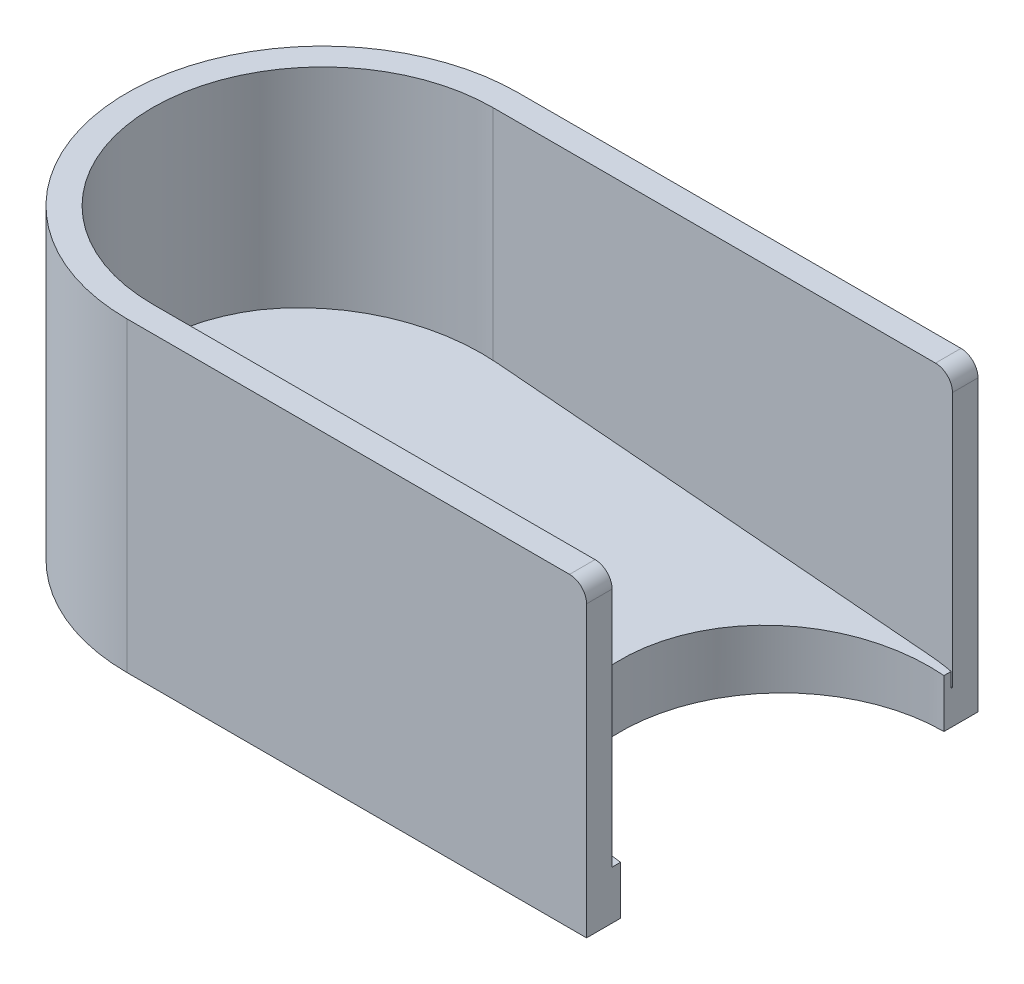
ISO-10303-21;
HEADER;
FILE_DESCRIPTION(('STEP AP214'),'2;1');
FILE_NAME('part.step','',(''),(''),'','','');
FILE_SCHEMA(('AUTOMOTIVE_DESIGN { 1 0 10303 214 1 1 1 1 }'));
ENDSEC;
DATA;
#1=APPLICATION_CONTEXT('core data for automotive mechanical design processes');
#2=APPLICATION_PROTOCOL_DEFINITION('international standard','automotive_design',2000,#1);
#3=PRODUCT_CONTEXT('',#1,'mechanical');
#4=PRODUCT('Part','Part','',(#3));
#5=PRODUCT_RELATED_PRODUCT_CATEGORY('part','',(#4));
#6=PRODUCT_DEFINITION_FORMATION('','',#4);
#7=PRODUCT_DEFINITION_CONTEXT('part definition',#1,'design');
#8=PRODUCT_DEFINITION('design','',#6,#7);
#9=PRODUCT_DEFINITION_SHAPE('','',#8);
#10=(LENGTH_UNIT() NAMED_UNIT(*) SI_UNIT(.MILLI.,.METRE.));
#11=(NAMED_UNIT(*) PLANE_ANGLE_UNIT() SI_UNIT($,.RADIAN.));
#12=(NAMED_UNIT(*) SI_UNIT($,.STERADIAN.) SOLID_ANGLE_UNIT());
#13=UNCERTAINTY_MEASURE_WITH_UNIT(LENGTH_MEASURE(1.E-05),#10,'distance_accuracy_value','');
#14=(GEOMETRIC_REPRESENTATION_CONTEXT(3) GLOBAL_UNCERTAINTY_ASSIGNED_CONTEXT((#13)) GLOBAL_UNIT_ASSIGNED_CONTEXT((#10,
#11,#12)) REPRESENTATION_CONTEXT('',''));
#15=CARTESIAN_POINT('',(0.,0.,0.));
#16=DIRECTION('',(0.,0.,1.));
#17=DIRECTION('',(1.,0.,0.));
#18=AXIS2_PLACEMENT_3D('',#15,#16,#17);
#19=CARTESIAN_POINT('',(11.3720016959949,-7.00398007205979,0.523165407703213));
#20=DIRECTION('',(0.0847998304005088,0.996398007205978,0.));
#21=DIRECTION('',(-0.996398007205978,0.0847998304005088,0.));
#22=AXIS2_PLACEMENT_3D('',#19,#20,#21);
#23=CYLINDRICAL_SURFACE('',#22,10.5231654077032);
#24=CARTESIAN_POINT('',(12.22,2.96,0.523165407703213));
#25=DIRECTION('',(0.0847998304005088,0.996398007205978,0.));
#26=DIRECTION('',(0.996398007205978,-0.0847998304005088,0.));
#27=AXIS2_PLACEMENT_3D('',#24,#25,#26);
#28=CIRCLE('',#27,10.5231654077032);
#29=CARTESIAN_POINT('',(13.5,2.85106382978723,-9.92129451651981));
#30=VERTEX_POINT('',#29);
#31=CARTESIAN_POINT('',(12.22,2.96,-10.));
#32=VERTEX_POINT('',#31);
#33=EDGE_CURVE('E178',#30,#32,#28,.T.);
#34=ORIENTED_EDGE('',*,*,#33,.F.);
#35=CARTESIAN_POINT('',(13.5,17.9999999999999,0.523165407703214));
#36=DIRECTION('',(1.,0.,0.));
#37=DIRECTION('',(0.,1.,0.));
#38=AXIS2_PLACEMENT_3D('',#35,#36,#37);
#39=ELLIPSE('',#38,124.094179882229,10.5231654077032);
#40=CARTESIAN_POINT('',(13.5,2.,-9.91216454977667));
#41=VERTEX_POINT('',#40);
#42=EDGE_CURVE('E169',#30,#41,#39,.F.);
#43=ORIENTED_EDGE('',*,*,#42,.T.);
#44=CARTESIAN_POINT('',(12.1382978723404,2.,0.523165407703213));
#45=DIRECTION('',(0.,1.,0.));
#46=DIRECTION('',(1.,0.,0.));
#47=AXIS2_PLACEMENT_3D('',#44,#45,#46);
#48=ELLIPSE('',#47,10.5612067984875,10.5231654077032);
#49=CARTESIAN_POINT('',(12.1382978723404,2.,-10.));
#50=VERTEX_POINT('',#49);
#51=EDGE_CURVE('E308',#41,#50,#48,.T.);
#52=ORIENTED_EDGE('',*,*,#51,.T.);
#53=DIRECTION('',(0.0847998304005088,0.996398007205978,0.));
#54=VECTOR('',#53,1.);
#55=CARTESIAN_POINT('',(11.3720016959949,-7.00398007205979,-10.));
#56=LINE('',#55,#54);
#57=EDGE_CURVE('E189',#50,#32,#56,.T.);
#58=ORIENTED_EDGE('',*,*,#57,.T.);
#59=EDGE_LOOP('',(#34,#43,#52,#58));
#60=FACE_BOUND('',#59,.T.);
#61=ADVANCED_FACE('F41',(#60),#23,.T.);
#62=CARTESIAN_POINT('',(-13.5,18.,0.));
#63=DIRECTION('',(0.,1.,0.));
#64=DIRECTION('',(0.,0.,1.));
#65=AXIS2_PLACEMENT_3D('',#62,#63,#64);
#66=PLANE('',#65);
#67=DIRECTION('',(-1.,0.,0.));
#68=VECTOR('',#67,1.);
#69=CARTESIAN_POINT('',(-13.5,18.,-10.));
#70=LINE('',#69,#68);
#71=CARTESIAN_POINT('',(12.5,18.,-10.));
#72=VERTEX_POINT('',#71);
#73=CARTESIAN_POINT('',(-13.5,18.,-10.));
#74=VERTEX_POINT('',#73);
#75=EDGE_CURVE('E271',#72,#74,#70,.T.);
#76=ORIENTED_EDGE('',*,*,#75,.F.);
#77=DIRECTION('',(0.,0.,-1.));
#78=VECTOR('',#77,1.);
#79=CARTESIAN_POINT('',(12.5,18.,0.));
#80=LINE('',#79,#78);
#81=CARTESIAN_POINT('',(12.5,18.,-11.5));
#82=VERTEX_POINT('',#81);
#83=EDGE_CURVE('E316',#72,#82,#80,.T.);
#84=ORIENTED_EDGE('',*,*,#83,.T.);
#85=DIRECTION('',(-1.,0.,0.));
#86=VECTOR('',#85,1.);
#87=CARTESIAN_POINT('',(-13.5,18.,-11.5));
#88=LINE('',#87,#86);
#89=CARTESIAN_POINT('',(-13.5,18.,-11.5));
#90=VERTEX_POINT('',#89);
#91=EDGE_CURVE('E290',#82,#90,#88,.T.);
#92=ORIENTED_EDGE('',*,*,#91,.T.);
#93=CARTESIAN_POINT('',(-13.5,18.,0.));
#94=DIRECTION('',(0.,1.,0.));
#95=DIRECTION('',(0.,0.,1.));
#96=AXIS2_PLACEMENT_3D('',#93,#94,#95);
#97=CIRCLE('',#96,11.5);
#98=CARTESIAN_POINT('',(-13.5,18.,11.5));
#99=VERTEX_POINT('',#98);
#100=EDGE_CURVE('E284',#90,#99,#97,.T.);
#101=ORIENTED_EDGE('',*,*,#100,.T.);
#102=DIRECTION('',(1.,0.,0.));
#103=VECTOR('',#102,1.);
#104=CARTESIAN_POINT('',(-13.5,18.,11.5));
#105=LINE('',#104,#103);
#106=CARTESIAN_POINT('',(12.5,18.,11.5));
#107=VERTEX_POINT('',#106);
#108=EDGE_CURVE('E287',#99,#107,#105,.T.);
#109=ORIENTED_EDGE('',*,*,#108,.T.);
#110=DIRECTION('',(0.,0.,-1.));
#111=VECTOR('',#110,1.);
#112=CARTESIAN_POINT('',(12.5,18.,0.));
#113=LINE('',#112,#111);
#114=CARTESIAN_POINT('',(12.5,18.,10.));
#115=VERTEX_POINT('',#114);
#116=EDGE_CURVE('E313',#107,#115,#113,.T.);
#117=ORIENTED_EDGE('',*,*,#116,.T.);
#118=DIRECTION('',(1.,0.,0.));
#119=VECTOR('',#118,1.);
#120=CARTESIAN_POINT('',(-13.5,18.,10.));
#121=LINE('',#120,#119);
#122=CARTESIAN_POINT('',(-13.5,18.,10.));
#123=VERTEX_POINT('',#122);
#124=EDGE_CURVE('E267',#123,#115,#121,.T.);
#125=ORIENTED_EDGE('',*,*,#124,.F.);
#126=CARTESIAN_POINT('',(-13.5,18.,0.));
#127=DIRECTION('',(0.,1.,0.));
#128=DIRECTION('',(0.,0.,1.));
#129=AXIS2_PLACEMENT_3D('',#126,#127,#128);
#130=CIRCLE('',#129,10.);
#131=EDGE_CURVE('E265',#74,#123,#130,.T.);
#132=ORIENTED_EDGE('',*,*,#131,.F.);
#133=EDGE_LOOP('',(#76,#84,#92,#101,#109,#117,#125,#132));
#134=FACE_BOUND('',#133,.T.);
#135=ADVANCED_FACE('F238',(#134),#66,.T.);
#136=CARTESIAN_POINT('',(-13.5,0.,0.));
#137=DIRECTION('',(0.,1.,0.));
#138=DIRECTION('',(0.,0.,1.));
#139=AXIS2_PLACEMENT_3D('',#136,#137,#138);
#140=PLANE('',#139);
#141=CARTESIAN_POINT('',(-13.5,0.,0.));
#142=DIRECTION('',(0.,-1.,0.));
#143=DIRECTION('',(0.,0.,-1.));
#144=AXIS2_PLACEMENT_3D('',#141,#142,#143);
#145=CIRCLE('',#144,2.56);
#146=CARTESIAN_POINT('',(-13.5,0.,-2.56));
#147=VERTEX_POINT('',#146);
#148=EDGE_CURVE('E181',#147,#147,#145,.T.);
#149=ORIENTED_EDGE('',*,*,#148,.F.);
#150=EDGE_LOOP('',(#149));
#151=FACE_BOUND('',#150,.T.);
#152=DIRECTION('',(0.,0.,-1.));
#153=VECTOR('',#152,1.);
#154=CARTESIAN_POINT('',(13.5,0.,0.));
#155=LINE('',#154,#153);
#156=CARTESIAN_POINT('',(13.5,0.,11.5));
#157=VERTEX_POINT('',#156);
#158=CARTESIAN_POINT('',(13.5,0.,9.5));
#159=VERTEX_POINT('',#158);
#160=EDGE_CURVE('E171',#157,#159,#155,.T.);
#161=ORIENTED_EDGE('',*,*,#160,.F.);
#162=DIRECTION('',(1.,0.,0.));
#163=VECTOR('',#162,1.);
#164=CARTESIAN_POINT('',(-13.5,0.,11.5));
#165=LINE('',#164,#163);
#166=CARTESIAN_POINT('',(-13.5,0.,11.5));
#167=VERTEX_POINT('',#166);
#168=EDGE_CURVE('E295',#167,#157,#165,.T.);
#169=ORIENTED_EDGE('',*,*,#168,.F.);
#170=CARTESIAN_POINT('',(-13.5,0.,0.));
#171=DIRECTION('',(0.,1.,0.));
#172=DIRECTION('',(0.,0.,1.));
#173=AXIS2_PLACEMENT_3D('',#170,#171,#172);
#174=CIRCLE('',#173,11.5);
#175=CARTESIAN_POINT('',(-13.5,0.,-11.5));
#176=VERTEX_POINT('',#175);
#177=EDGE_CURVE('E277',#176,#167,#174,.T.);
#178=ORIENTED_EDGE('',*,*,#177,.F.);
#179=DIRECTION('',(-1.,0.,0.));
#180=VECTOR('',#179,1.);
#181=CARTESIAN_POINT('',(-13.5,0.,-11.5));
#182=LINE('',#181,#180);
#183=CARTESIAN_POINT('',(13.5,0.,-11.5));
#184=VERTEX_POINT('',#183);
#185=EDGE_CURVE('E168',#184,#176,#182,.T.);
#186=ORIENTED_EDGE('',*,*,#185,.F.);
#187=CARTESIAN_POINT('',(13.5,0.,-9.5));
#188=VERTEX_POINT('',#187);
#189=EDGE_CURVE('E151',#188,#184,#155,.T.);
#190=ORIENTED_EDGE('',*,*,#189,.F.);
#191=CARTESIAN_POINT('',(13.5,0.,0.));
#192=DIRECTION('',(0.,-1.,0.));
#193=DIRECTION('',(0.,0.,-1.));
#194=AXIS2_PLACEMENT_3D('',#191,#192,#193);
#195=CIRCLE('',#194,9.5);
#196=EDGE_CURVE('E166',#159,#188,#195,.T.);
#197=ORIENTED_EDGE('',*,*,#196,.F.);
#198=EDGE_LOOP('',(#161,#169,#178,#186,#190,#197));
#199=FACE_BOUND('',#198,.T.);
#200=ADVANCED_FACE('F165',(#151,#199),#140,.F.);
#201=CARTESIAN_POINT('',(-13.5,2.,0.));
#202=DIRECTION('',(0.,1.,0.));
#203=DIRECTION('',(0.,0.,1.));
#204=AXIS2_PLACEMENT_3D('',#201,#202,#203);
#205=PLANE('',#204);
#206=ORIENTED_EDGE('',*,*,#51,.F.);
#207=DIRECTION('',(0.,0.,-1.));
#208=VECTOR('',#207,1.);
#209=CARTESIAN_POINT('',(13.5,2.,0.));
#210=LINE('',#209,#208);
#211=CARTESIAN_POINT('',(13.5,2.,-10.));
#212=VERTEX_POINT('',#211);
#213=EDGE_CURVE('E336',#41,#212,#210,.T.);
#214=ORIENTED_EDGE('',*,*,#213,.T.);
#215=DIRECTION('',(-1.,0.,0.));
#216=VECTOR('',#215,1.);
#217=CARTESIAN_POINT('',(-13.5,2.,-10.));
#218=LINE('',#217,#216);
#219=EDGE_CURVE('E273',#212,#50,#218,.T.);
#220=ORIENTED_EDGE('',*,*,#219,.T.);
#221=EDGE_LOOP('',(#206,#214,#220));
#222=FACE_BOUND('',#221,.T.);
#223=ADVANCED_FACE('F217',(#222),#205,.T.);
#224=CARTESIAN_POINT('',(-13.2339325842697,5.12629213483146,0.523165407703214));
#225=DIRECTION('',(-0.0847998304005088,-0.996398007205978,0.));
#226=DIRECTION('',(0.996398007205978,-0.0847998304005088,0.));
#227=AXIS2_PLACEMENT_3D('',#224,#225,#226);
#228=PLANE('',#227);
#229=DIRECTION('',(0.,0.,1.));
#230=VECTOR('',#229,1.);
#231=CARTESIAN_POINT('',(13.5,2.85106382978723,0.523165407703214));
#232=LINE('',#231,#230);
#233=CARTESIAN_POINT('',(13.5,2.85106382978723,-9.5));
#234=VERTEX_POINT('',#233);
#235=EDGE_CURVE('E154',#30,#234,#232,.T.);
#236=ORIENTED_EDGE('',*,*,#235,.F.);
#237=ORIENTED_EDGE('',*,*,#33,.T.);
#238=DIRECTION('',(-0.996398007205978,0.0847998304005088,0.));
#239=VECTOR('',#238,1.);
#240=CARTESIAN_POINT('',(-13.2339325842697,5.12629213483146,-10.));
#241=LINE('',#240,#239);
#242=CARTESIAN_POINT('',(-13.2339325842697,5.12629213483146,-10.));
#243=VERTEX_POINT('',#242);
#244=EDGE_CURVE('E186',#32,#243,#241,.T.);
#245=ORIENTED_EDGE('',*,*,#244,.T.);
#246=CARTESIAN_POINT('',(-13.2339325842697,5.12629213483146,0.523165407703214));
#247=DIRECTION('',(0.0847998304005088,0.996398007205978,0.));
#248=DIRECTION('',(0.996398007205978,-0.0847998304005088,0.));
#249=AXIS2_PLACEMENT_3D('',#246,#247,#248);
#250=CIRCLE('',#249,10.5231654077032);
#251=CARTESIAN_POINT('',(-22.1815400299766,5.88779064084907,-4.96294899318803));
#252=VERTEX_POINT('',#251);
#253=EDGE_CURVE('E174',#243,#252,#250,.T.);
#254=ORIENTED_EDGE('',*,*,#253,.T.);
#255=CARTESIAN_POINT('',(-13.5,5.14893617021276,0.));
#256=DIRECTION('',(-0.0847998304005088,-0.996398007205978,0.));
#257=DIRECTION('',(-0.996398007205978,0.0847998304005088,0.));
#258=AXIS2_PLACEMENT_3D('',#255,#256,#257);
#259=ELLIPSE('',#258,10.0361501404857,10.);
#260=CARTESIAN_POINT('',(-13.5,5.14893617021276,10.));
#261=VERTEX_POINT('',#260);
#262=EDGE_CURVE('E202',#252,#261,#259,.F.);
#263=ORIENTED_EDGE('',*,*,#262,.T.);
#264=DIRECTION('',(0.996398007205978,-0.0847998304005088,0.));
#265=VECTOR('',#264,1.);
#266=CARTESIAN_POINT('',(-13.2339325842697,5.12629213483146,10.));
#267=LINE('',#266,#265);
#268=CARTESIAN_POINT('',(13.5,2.85106382978723,10.));
#269=VERTEX_POINT('',#268);
#270=EDGE_CURVE('E262',#261,#269,#267,.T.);
#271=ORIENTED_EDGE('',*,*,#270,.T.);
#272=CARTESIAN_POINT('',(13.5,2.85106382978723,9.5));
#273=VERTEX_POINT('',#272);
#274=EDGE_CURVE('E338',#273,#269,#232,.T.);
#275=ORIENTED_EDGE('',*,*,#274,.F.);
#276=CARTESIAN_POINT('',(13.5,2.85106382978723,0.));
#277=DIRECTION('',(-0.0847998304005088,-0.996398007205978,0.));
#278=DIRECTION('',(0.996398007205978,-0.0847998304005088,0.));
#279=AXIS2_PLACEMENT_3D('',#276,#277,#278);
#280=ELLIPSE('',#279,9.53434263346146,9.5);
#281=EDGE_CURVE('E160',#273,#234,#280,.T.);
#282=ORIENTED_EDGE('',*,*,#281,.T.);
#283=EDGE_LOOP('',(#236,#237,#245,#254,#263,#271,#275,#282));
#284=FACE_BOUND('',#283,.T.);
#285=ADVANCED_FACE('F220',(#284),#228,.F.);
#286=CARTESIAN_POINT('',(13.5,10.,0.));
#287=DIRECTION('',(0.,-1.,0.));
#288=DIRECTION('',(0.,0.,-1.));
#289=AXIS2_PLACEMENT_3D('',#286,#287,#288);
#290=CYLINDRICAL_SURFACE('',#289,9.5);
#291=DIRECTION('',(0.,-1.,0.));
#292=VECTOR('',#291,1.);
#293=CARTESIAN_POINT('',(13.5,10.,9.5));
#294=LINE('',#293,#292);
#295=EDGE_CURVE('E159',#159,#273,#294,.F.);
#296=ORIENTED_EDGE('',*,*,#295,.F.);
#297=ORIENTED_EDGE('',*,*,#196,.T.);
#298=DIRECTION('',(0.,-1.,0.));
#299=VECTOR('',#298,1.);
#300=CARTESIAN_POINT('',(13.5,10.,-9.5));
#301=LINE('',#300,#299);
#302=EDGE_CURVE('E147',#234,#188,#301,.T.);
#303=ORIENTED_EDGE('',*,*,#302,.F.);
#304=ORIENTED_EDGE('',*,*,#281,.F.);
#305=EDGE_LOOP('',(#296,#297,#303,#304));
#306=FACE_BOUND('',#305,.T.);
#307=ADVANCED_FACE('F173',(#306),#290,.F.);
#308=CARTESIAN_POINT('',(-13.5,2.,10.));
#309=DIRECTION('',(0.,0.,1.));
#310=DIRECTION('',(1.,0.,0.));
#311=AXIS2_PLACEMENT_3D('',#308,#309,#310);
#312=PLANE('',#311);
#313=ORIENTED_EDGE('',*,*,#124,.T.);
#314=CARTESIAN_POINT('',(12.5,17.,10.));
#315=DIRECTION('',(0.,0.,1.));
#316=DIRECTION('',(1.,0.,0.));
#317=AXIS2_PLACEMENT_3D('',#314,#315,#316);
#318=CIRCLE('',#317,1.);
#319=CARTESIAN_POINT('',(13.5,17.,10.));
#320=VERTEX_POINT('',#319);
#321=EDGE_CURVE('E63',#115,#320,#318,.F.);
#322=ORIENTED_EDGE('',*,*,#321,.T.);
#323=DIRECTION('',(0.,1.,0.));
#324=VECTOR('',#323,1.);
#325=CARTESIAN_POINT('',(13.5,2.,10.));
#326=LINE('',#325,#324);
#327=EDGE_CURVE('E280',#269,#320,#326,.T.);
#328=ORIENTED_EDGE('',*,*,#327,.F.);
#329=ORIENTED_EDGE('',*,*,#270,.F.);
#330=DIRECTION('',(0.,1.,0.));
#331=VECTOR('',#330,1.);
#332=CARTESIAN_POINT('',(-13.5,2.,10.));
#333=LINE('',#332,#331);
#334=EDGE_CURVE('E282',#261,#123,#333,.T.);
#335=ORIENTED_EDGE('',*,*,#334,.T.);
#336=EDGE_LOOP('',(#313,#322,#328,#329,#335));
#337=FACE_BOUND('',#336,.T.);
#338=ADVANCED_FACE('F224',(#337),#312,.F.);
#339=CARTESIAN_POINT('',(-13.5,18.,0.));
#340=DIRECTION('',(0.,-1.,0.));
#341=DIRECTION('',(0.,0.,-1.));
#342=AXIS2_PLACEMENT_3D('',#339,#340,#341);
#343=CYLINDRICAL_SURFACE('',#342,11.5);
#344=ORIENTED_EDGE('',*,*,#177,.T.);
#345=DIRECTION('',(0.,-1.,0.));
#346=VECTOR('',#345,1.);
#347=CARTESIAN_POINT('',(-13.5,18.,11.5));
#348=LINE('',#347,#346);
#349=EDGE_CURVE('E305',#99,#167,#348,.T.);
#350=ORIENTED_EDGE('',*,*,#349,.F.);
#351=ORIENTED_EDGE('',*,*,#100,.F.);
#352=DIRECTION('',(0.,-1.,0.));
#353=VECTOR('',#352,1.);
#354=CARTESIAN_POINT('',(-13.5,18.,-11.5));
#355=LINE('',#354,#353);
#356=EDGE_CURVE('E292',#90,#176,#355,.T.);
#357=ORIENTED_EDGE('',*,*,#356,.T.);
#358=EDGE_LOOP('',(#344,#350,#351,#357));
#359=FACE_BOUND('',#358,.T.);
#360=ADVANCED_FACE('F226',(#359),#343,.T.);
#361=CARTESIAN_POINT('',(-13.5,18.,11.5));
#362=DIRECTION('',(0.,0.,-1.));
#363=DIRECTION('',(-1.,0.,0.));
#364=AXIS2_PLACEMENT_3D('',#361,#362,#363);
#365=PLANE('',#364);
#366=DIRECTION('',(0.,-1.,0.));
#367=VECTOR('',#366,1.);
#368=CARTESIAN_POINT('',(13.5,18.,11.5));
#369=LINE('',#368,#367);
#370=CARTESIAN_POINT('',(13.5,17.,11.5));
#371=VERTEX_POINT('',#370);
#372=EDGE_CURVE('E303',#371,#157,#369,.T.);
#373=ORIENTED_EDGE('',*,*,#372,.F.);
#374=CARTESIAN_POINT('',(12.5,17.,11.5));
#375=DIRECTION('',(0.,0.,-1.));
#376=DIRECTION('',(-1.,0.,0.));
#377=AXIS2_PLACEMENT_3D('',#374,#375,#376);
#378=CIRCLE('',#377,1.);
#379=EDGE_CURVE('E11',#371,#107,#378,.F.);
#380=ORIENTED_EDGE('',*,*,#379,.T.);
#381=ORIENTED_EDGE('',*,*,#108,.F.);
#382=ORIENTED_EDGE('',*,*,#349,.T.);
#383=ORIENTED_EDGE('',*,*,#168,.T.);
#384=EDGE_LOOP('',(#373,#380,#381,#382,#383));
#385=FACE_BOUND('',#384,.T.);
#386=ADVANCED_FACE('F232',(#385),#365,.F.);
#387=CARTESIAN_POINT('',(-13.5,18.,-11.5));
#388=DIRECTION('',(0.,0.,1.));
#389=DIRECTION('',(1.,0.,0.));
#390=AXIS2_PLACEMENT_3D('',#387,#388,#389);
#391=PLANE('',#390);
#392=ORIENTED_EDGE('',*,*,#91,.F.);
#393=CARTESIAN_POINT('',(12.5,17.,-11.5));
#394=DIRECTION('',(0.,0.,1.));
#395=DIRECTION('',(1.,0.,0.));
#396=AXIS2_PLACEMENT_3D('',#393,#394,#395);
#397=CIRCLE('',#396,1.);
#398=CARTESIAN_POINT('',(13.5,17.,-11.5));
#399=VERTEX_POINT('',#398);
#400=EDGE_CURVE('E319',#82,#399,#397,.F.);
#401=ORIENTED_EDGE('',*,*,#400,.T.);
#402=DIRECTION('',(0.,-1.,0.));
#403=VECTOR('',#402,1.);
#404=CARTESIAN_POINT('',(13.5,18.,-11.5));
#405=LINE('',#404,#403);
#406=EDGE_CURVE('E301',#399,#184,#405,.T.);
#407=ORIENTED_EDGE('',*,*,#406,.T.);
#408=ORIENTED_EDGE('',*,*,#185,.T.);
#409=ORIENTED_EDGE('',*,*,#356,.F.);
#410=EDGE_LOOP('',(#392,#401,#407,#408,#409));
#411=FACE_BOUND('',#410,.T.);
#412=ADVANCED_FACE('F333',(#411),#391,.F.);
#413=CARTESIAN_POINT('',(-13.5,2.,0.));
#414=DIRECTION('',(0.,1.,0.));
#415=DIRECTION('',(0.,0.,1.));
#416=AXIS2_PLACEMENT_3D('',#413,#414,#415);
#417=CYLINDRICAL_SURFACE('',#416,10.);
#418=ORIENTED_EDGE('',*,*,#262,.F.);
#419=CARTESIAN_POINT('',(-19.7998576787423,18.,7.76606677975358));
#420=CARTESIAN_POINT('',(-19.8906555550619,17.7571511611915,7.69238786549662));
#421=CARTESIAN_POINT('',(-19.9829764338366,17.516003840433,7.61487782050297));
#422=CARTESIAN_POINT('',(-20.170272390747,17.0375530989512,7.45137737090945));
#423=CARTESIAN_POINT('',(-20.2652483189841,16.8002509487077,7.36538422735462));
#424=CARTESIAN_POINT('',(-20.4576920114659,16.3293827527318,7.18387378405213));
#425=CARTESIAN_POINT('',(-20.5551664080744,16.0958300822981,7.08832863120882));
#426=CARTESIAN_POINT('',(-20.7516561039576,15.6338079904177,6.88717957492106));
#427=CARTESIAN_POINT('',(-20.8506712525536,15.4053380771442,6.78157664997274));
#428=CARTESIAN_POINT('',(-21.1494702024691,14.7270330589644,6.44787298644273));
#429=CARTESIAN_POINT('',(-21.3504700421644,14.285604113256,6.20336801976336));
#430=CARTESIAN_POINT('',(-21.7462169078818,13.4305428420255,5.66662230791622));
#431=CARTESIAN_POINT('',(-21.9409725620231,13.0168712136694,5.37445115821708));
#432=CARTESIAN_POINT('',(-22.2561447023577,12.3406862990706,4.83688959439064));
#433=CARTESIAN_POINT('',(-22.3812280496926,12.0702997352377,4.60408163360494));
#434=CARTESIAN_POINT('',(-22.6179985702154,11.5448910846656,4.11531290414037));
#435=CARTESIAN_POINT('',(-22.729684562122,11.2898703537587,3.8593500973212));
#436=CARTESIAN_POINT('',(-22.9346069204447,10.7962749504249,3.32704153801084));
#437=CARTESIAN_POINT('',(-23.0279105748612,10.557642461826,3.05077540644176));
#438=CARTESIAN_POINT('',(-23.1922384583782,10.0953747263457,2.4796740487282));
#439=CARTESIAN_POINT('',(-23.2632632725392,9.87173908575611,2.18483931045471));
#440=CARTESIAN_POINT('',(-23.3794983317417,9.43750373781983,1.57839321949936));
#441=CARTESIAN_POINT('',(-23.4245706236064,9.22697890482726,1.26670167446767));
#442=CARTESIAN_POINT('',(-23.4851007999022,8.81912587108749,0.631977816157253));
#443=CARTESIAN_POINT('',(-23.5005576515267,8.62179813080623,0.308945107767732));
#444=CARTESIAN_POINT('',(-23.4994107914904,8.23881490400064,-0.344476238196957));
#445=CARTESIAN_POINT('',(-23.4827665380426,8.0531744836461,-0.674873656038717));
#446=CARTESIAN_POINT('',(-23.4156831392412,7.69248993684322,-1.33800995781581));
#447=CARTESIAN_POINT('',(-23.3652464756157,7.51744503328511,-1.67074866803017));
#448=CARTESIAN_POINT('',(-23.2348872942366,7.18960443675866,-2.30862500787449));
#449=CARTESIAN_POINT('',(-23.1575034305327,7.03612961965427,-2.61393444976065));
#450=CARTESIAN_POINT('',(-22.9730416082807,6.73608254134311,-3.21892475643367));
#451=CARTESIAN_POINT('',(-22.8659650431055,6.58950995661659,-3.51860588463286));
#452=CARTESIAN_POINT('',(-22.6225486133741,6.3024138961373,-4.10863888647765));
#453=CARTESIAN_POINT('',(-22.4862232810072,6.16188745784454,-4.3989953110163));
#454=CARTESIAN_POINT('',(-22.1851073303403,5.88596811021893,-4.9671177795365));
#455=CARTESIAN_POINT('',(-22.0203176176437,5.75057503773349,-5.24488422371746));
#456=CARTESIAN_POINT('',(-21.6726329668049,5.49096742016041,-5.7708168929907));
#457=CARTESIAN_POINT('',(-21.4910900002885,5.36653492658362,-6.01977025826609));
#458=CARTESIAN_POINT('',(-21.104885422071,5.12103691220513,-6.5008347840496));
#459=CARTESIAN_POINT('',(-20.9002245389334,4.99997128544605,-6.73294647494643));
#460=CARTESIAN_POINT('',(-20.4694396072408,4.76068608008546,-7.17793963399838));
#461=CARTESIAN_POINT('',(-20.2433149564202,4.64246658146203,-7.3908205622179));
#462=CARTESIAN_POINT('',(-19.7715239961248,4.40841753380944,-7.79515872920798));
#463=CARTESIAN_POINT('',(-19.525858282556,4.2925879120364,-7.98661662084723));
#464=CARTESIAN_POINT('',(-19.0246270680555,4.06629420820385,-8.34085630527379));
#465=CARTESIAN_POINT('',(-18.769567281988,3.95577263626322,-8.50431734163331));
#466=CARTESIAN_POINT('',(-18.2451780330799,3.73625115752712,-8.80766914964903));
#467=CARTESIAN_POINT('',(-17.975848811401,3.62725122505437,-8.94756031948271));
#468=CARTESIAN_POINT('',(-17.4253210510723,3.410516198832,-9.20238031333681));
#469=CARTESIAN_POINT('',(-17.1441285900789,3.30278049271337,-9.31732173825984));
#470=CARTESIAN_POINT('',(-16.5722383543105,3.08827375069864,-9.52121363637487));
#471=CARTESIAN_POINT('',(-16.2815432082096,2.98150245827995,-9.61017123079888));
#472=CARTESIAN_POINT('',(-15.5937558312533,2.73271467085994,-9.7867850344613));
#473=CARTESIAN_POINT('',(-15.1938280946271,2.59094905764278,-9.86389550439018));
#474=CARTESIAN_POINT('',(-14.3879496556162,2.30822757218556,-9.96876504528107));
#475=CARTESIAN_POINT('',(-13.9820111896596,2.16727069777562,-9.99661335158581));
#476=CARTESIAN_POINT('',(-13.5508078761479,2.01763108923002,-9.99990341474185));
#477=CARTESIAN_POINT('',(-13.5254032329779,2.0088153002612,-10.0000002407852));
#478=CARTESIAN_POINT('',(-13.5,1.99999999999996,-10.));
#479=B_SPLINE_CURVE_WITH_KNOTS('',3,(#419,#420,#421,#422,#423,#424,#425,#426,#427,#428,#429,
#430,#431,#432,#433,#434,#435,#436,#437,#438,#439,#440,#441,#442,#443,#444,#445,#446,#447,#448,
#449,#450,#451,#452,#453,#454,#455,#456,#457,#458,#459,#460,#461,#462,#463,#464,#465,#466,#467,
#468,#469,#470,#471,#472,#473,#474,#475,#476,#477,#478),.UNSPECIFIED.,.F.,.F.,(4,2,2,2,2,2,2,2,
2,2,2,2,2,2,2,2,2,2,2,2,2,2,2,2,2,2,2,2,2,4),(0.,0.808603285847511,1.6174685068997,
2.42876522343933,3.23998309136704,4.86687666118053,6.49141578518705,7.62455507659711,
8.75779420664357,9.88680476108767,11.015785664309,12.1507136546457,13.2856812236502,
14.4220831278815,15.5584015834464,16.6081639221254,17.6578770075256,18.7070697479685,
19.7562291141564,20.7518817407557,21.7475029980093,22.7431522003009,23.7387710518375,
24.7050240227339,25.6712606686011,26.6370081739986,27.6024907539153,28.8934094752974,
30.1819873739042,30.2626594344538),.UNSPECIFIED.);
#480=CARTESIAN_POINT('',(-13.5,2.,-10.));
#481=VERTEX_POINT('',#480);
#482=EDGE_CURVE('E192',#252,#481,#479,.T.);
#483=ORIENTED_EDGE('',*,*,#482,.T.);
#484=DIRECTION('',(0.,1.,0.));
#485=VECTOR('',#484,1.);
#486=CARTESIAN_POINT('',(-13.5,2.,-10.));
#487=LINE('',#486,#485);
#488=EDGE_CURVE('E257',#481,#74,#487,.T.);
#489=ORIENTED_EDGE('',*,*,#488,.T.);
#490=ORIENTED_EDGE('',*,*,#131,.T.);
#491=ORIENTED_EDGE('',*,*,#334,.F.);
#492=EDGE_LOOP('',(#418,#483,#489,#490,#491));
#493=FACE_BOUND('',#492,.T.);
#494=ADVANCED_FACE('F204',(#493),#417,.F.);
#495=CARTESIAN_POINT('',(-13.5,2.,-10.));
#496=DIRECTION('',(0.,0.,-1.));
#497=DIRECTION('',(-1.,0.,0.));
#498=AXIS2_PLACEMENT_3D('',#495,#496,#497);
#499=PLANE('',#498);
#500=DIRECTION('',(0.,1.,0.));
#501=VECTOR('',#500,1.);
#502=CARTESIAN_POINT('',(13.5,2.,-10.));
#503=LINE('',#502,#501);
#504=CARTESIAN_POINT('',(13.5,17.,-10.));
#505=VERTEX_POINT('',#504);
#506=EDGE_CURVE('E278',#212,#505,#503,.T.);
#507=ORIENTED_EDGE('',*,*,#506,.T.);
#508=CARTESIAN_POINT('',(12.5,17.,-10.));
#509=DIRECTION('',(0.,0.,-1.));
#510=DIRECTION('',(-1.,0.,0.));
#511=AXIS2_PLACEMENT_3D('',#508,#509,#510);
#512=CIRCLE('',#511,1.);
#513=EDGE_CURVE('E323',#505,#72,#512,.F.);
#514=ORIENTED_EDGE('',*,*,#513,.T.);
#515=ORIENTED_EDGE('',*,*,#75,.T.);
#516=ORIENTED_EDGE('',*,*,#488,.F.);
#517=DIRECTION('',(0.0847998304005088,0.996398007205978,0.));
#518=VECTOR('',#517,1.);
#519=CARTESIAN_POINT('',(-14.0819308882747,-4.83768793722833,-10.));
#520=LINE('',#519,#518);
#521=EDGE_CURVE('E190',#481,#243,#520,.T.);
#522=ORIENTED_EDGE('',*,*,#521,.T.);
#523=ORIENTED_EDGE('',*,*,#244,.F.);
#524=ORIENTED_EDGE('',*,*,#57,.F.);
#525=ORIENTED_EDGE('',*,*,#219,.F.);
#526=EDGE_LOOP('',(#507,#514,#515,#516,#522,#523,#524,#525));
#527=FACE_BOUND('',#526,.T.);
#528=ADVANCED_FACE('F214',(#527),#499,.F.);
#529=CARTESIAN_POINT('',(-14.0819308882747,-4.83768793722833,0.523165407703214));
#530=DIRECTION('',(0.0847998304005088,0.996398007205978,0.));
#531=DIRECTION('',(-0.996398007205978,0.0847998304005088,0.));
#532=AXIS2_PLACEMENT_3D('',#529,#530,#531);
#533=CYLINDRICAL_SURFACE('',#532,10.5231654077032);
#534=ORIENTED_EDGE('',*,*,#482,.F.);
#535=ORIENTED_EDGE('',*,*,#253,.F.);
#536=ORIENTED_EDGE('',*,*,#521,.F.);
#537=EDGE_LOOP('',(#534,#535,#536));
#538=FACE_BOUND('',#537,.T.);
#539=ADVANCED_FACE('F208',(#538),#533,.T.);
#540=CARTESIAN_POINT('',(-13.5,4.,0.));
#541=DIRECTION('',(0.,-1.,0.));
#542=DIRECTION('',(0.,0.,-1.));
#543=AXIS2_PLACEMENT_3D('',#540,#541,#542);
#544=CYLINDRICAL_SURFACE('',#543,2.56);
#545=CARTESIAN_POINT('',(-13.5,4.,0.));
#546=DIRECTION('',(0.,-1.,0.));
#547=DIRECTION('',(0.,0.,-1.));
#548=AXIS2_PLACEMENT_3D('',#545,#546,#547);
#549=CIRCLE('',#548,2.56);
#550=CARTESIAN_POINT('',(-13.5,4.,-2.56));
#551=VERTEX_POINT('',#550);
#552=EDGE_CURVE('E175',#551,#551,#549,.T.);
#553=ORIENTED_EDGE('',*,*,#552,.F.);
#554=EDGE_LOOP('',(#553));
#555=FACE_BOUND('',#554,.T.);
#556=ORIENTED_EDGE('',*,*,#148,.T.);
#557=EDGE_LOOP('',(#556));
#558=FACE_BOUND('',#557,.T.);
#559=ADVANCED_FACE('F213',(#555,#558),#544,.F.);
#560=CARTESIAN_POINT('',(-13.5,4.,0.));
#561=DIRECTION('',(0.,-1.,0.));
#562=DIRECTION('',(0.,0.,-1.));
#563=AXIS2_PLACEMENT_3D('',#560,#561,#562);
#564=PLANE('',#563);
#565=ORIENTED_EDGE('',*,*,#552,.T.);
#566=EDGE_LOOP('',(#565));
#567=FACE_BOUND('',#566,.T.);
#568=ADVANCED_FACE('F364',(#567),#564,.T.);
#569=CARTESIAN_POINT('',(13.5,0.,0.));
#570=DIRECTION('',(1.,0.,0.));
#571=DIRECTION('',(0.,0.,-1.));
#572=AXIS2_PLACEMENT_3D('',#569,#570,#571);
#573=PLANE('',#572);
#574=ORIENTED_EDGE('',*,*,#406,.F.);
#575=DIRECTION('',(0.,0.,-1.));
#576=VECTOR('',#575,1.);
#577=CARTESIAN_POINT('',(13.5,17.,0.));
#578=LINE('',#577,#576);
#579=EDGE_CURVE('E321',#399,#505,#578,.F.);
#580=ORIENTED_EDGE('',*,*,#579,.T.);
#581=ORIENTED_EDGE('',*,*,#506,.F.);
#582=ORIENTED_EDGE('',*,*,#213,.F.);
#583=ORIENTED_EDGE('',*,*,#42,.F.);
#584=ORIENTED_EDGE('',*,*,#235,.T.);
#585=ORIENTED_EDGE('',*,*,#302,.T.);
#586=ORIENTED_EDGE('',*,*,#189,.T.);
#587=EDGE_LOOP('',(#574,#580,#581,#582,#583,#584,#585,#586));
#588=FACE_BOUND('',#587,.T.);
#589=ADVANCED_FACE('F150',(#588),#573,.T.);
#590=ORIENTED_EDGE('',*,*,#327,.T.);
#591=DIRECTION('',(0.,0.,-1.));
#592=VECTOR('',#591,1.);
#593=CARTESIAN_POINT('',(13.5,17.,0.));
#594=LINE('',#593,#592);
#595=EDGE_CURVE('E49',#320,#371,#594,.F.);
#596=ORIENTED_EDGE('',*,*,#595,.T.);
#597=ORIENTED_EDGE('',*,*,#372,.T.);
#598=ORIENTED_EDGE('',*,*,#160,.T.);
#599=ORIENTED_EDGE('',*,*,#295,.T.);
#600=ORIENTED_EDGE('',*,*,#274,.T.);
#601=EDGE_LOOP('',(#590,#596,#597,#598,#599,#600));
#602=FACE_BOUND('',#601,.T.);
#603=ADVANCED_FACE('F354',(#602),#573,.T.);
#604=CARTESIAN_POINT('',(12.5,17.,0.));
#605=DIRECTION('',(0.,0.,-1.));
#606=DIRECTION('',(-1.,0.,0.));
#607=AXIS2_PLACEMENT_3D('',#604,#605,#606);
#608=CYLINDRICAL_SURFACE('',#607,1.);
#609=ORIENTED_EDGE('',*,*,#513,.F.);
#610=ORIENTED_EDGE('',*,*,#579,.F.);
#611=ORIENTED_EDGE('',*,*,#400,.F.);
#612=ORIENTED_EDGE('',*,*,#83,.F.);
#613=EDGE_LOOP('',(#609,#610,#611,#612));
#614=FACE_BOUND('',#613,.T.);
#615=ADVANCED_FACE('F331',(#614),#608,.T.);
#616=CARTESIAN_POINT('',(12.5,17.,0.));
#617=DIRECTION('',(0.,0.,-1.));
#618=DIRECTION('',(-1.,0.,0.));
#619=AXIS2_PLACEMENT_3D('',#616,#617,#618);
#620=CYLINDRICAL_SURFACE('',#619,1.);
#621=ORIENTED_EDGE('',*,*,#379,.F.);
#622=ORIENTED_EDGE('',*,*,#595,.F.);
#623=ORIENTED_EDGE('',*,*,#321,.F.);
#624=ORIENTED_EDGE('',*,*,#116,.F.);
#625=EDGE_LOOP('',(#621,#622,#623,#624));
#626=FACE_BOUND('',#625,.T.);
#627=ADVANCED_FACE('F43',(#626),#620,.T.);
#628=CLOSED_SHELL('',(#61,#135,#200,#223,#285,#307,#338,#360,#386,#412,#494,#528,#539,#559,#568,
#589,#603,#615,#627));
#629=MANIFOLD_SOLID_BREP('B2',#628);
#630=ADVANCED_BREP_SHAPE_REPRESENTATION('',(#18,#629),#14);
#631=SHAPE_DEFINITION_REPRESENTATION(#9,#630);
ENDSEC;
END-ISO-10303-21;
